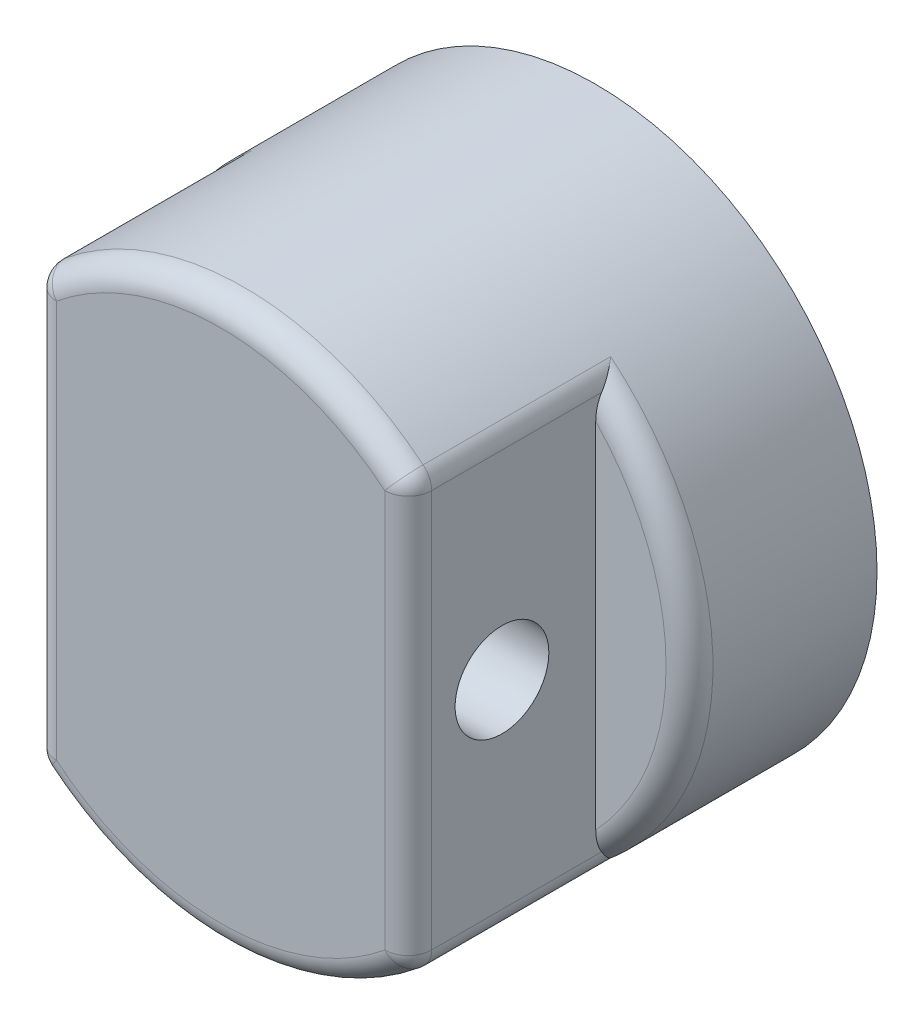
ISO-10303-21;
HEADER;
FILE_DESCRIPTION(('STEP AP214'),'2;1');
FILE_NAME('part.step','',(''),(''),'','','');
FILE_SCHEMA(('AUTOMOTIVE_DESIGN { 1 0 10303 214 1 1 1 1 }'));
ENDSEC;
DATA;
#1=APPLICATION_CONTEXT('core data for automotive mechanical design processes');
#2=APPLICATION_PROTOCOL_DEFINITION('international standard','automotive_design',2000,#1);
#3=PRODUCT_CONTEXT('',#1,'mechanical');
#4=PRODUCT('Part','Part','',(#3));
#5=PRODUCT_RELATED_PRODUCT_CATEGORY('part','',(#4));
#6=PRODUCT_DEFINITION_FORMATION('','',#4);
#7=PRODUCT_DEFINITION_CONTEXT('part definition',#1,'design');
#8=PRODUCT_DEFINITION('design','',#6,#7);
#9=PRODUCT_DEFINITION_SHAPE('','',#8);
#10=(LENGTH_UNIT() NAMED_UNIT(*) SI_UNIT(.MILLI.,.METRE.));
#11=(NAMED_UNIT(*) PLANE_ANGLE_UNIT() SI_UNIT($,.RADIAN.));
#12=(NAMED_UNIT(*) SI_UNIT($,.STERADIAN.) SOLID_ANGLE_UNIT());
#13=UNCERTAINTY_MEASURE_WITH_UNIT(LENGTH_MEASURE(1.E-05),#10,'distance_accuracy_value','');
#14=(GEOMETRIC_REPRESENTATION_CONTEXT(3) GLOBAL_UNCERTAINTY_ASSIGNED_CONTEXT((#13)) GLOBAL_UNIT_ASSIGNED_CONTEXT((#10,
#11,#12)) REPRESENTATION_CONTEXT('',''));
#15=CARTESIAN_POINT('',(0.,0.,0.));
#16=DIRECTION('',(0.,0.,1.));
#17=DIRECTION('',(1.,0.,0.));
#18=AXIS2_PLACEMENT_3D('',#15,#16,#17);
#19=CARTESIAN_POINT('',(0.,0.,40.));
#20=DIRECTION('',(0.,0.,1.));
#21=DIRECTION('',(1.,0.,0.));
#22=AXIS2_PLACEMENT_3D('',#19,#20,#21);
#23=PLANE('',#22);
#24=DIRECTION('',(0.,1.,0.));
#25=VECTOR('',#24,1.);
#26=CARTESIAN_POINT('',(40.,-40.3112887414927,40.));
#27=LINE('',#26,#25);
#28=CARTESIAN_POINT('',(40.,-37.7491721763537,40.));
#29=VERTEX_POINT('',#28);
#30=CARTESIAN_POINT('',(40.,37.7491721763537,40.));
#31=VERTEX_POINT('',#30);
#32=EDGE_CURVE('E140',#29,#31,#27,.T.);
#33=ORIENTED_EDGE('',*,*,#32,.F.);
#34=CARTESIAN_POINT('',(0.,0.,40.));
#35=DIRECTION('',(0.,0.,1.));
#36=DIRECTION('',(1.,0.,0.));
#37=AXIS2_PLACEMENT_3D('',#34,#35,#36);
#38=CIRCLE('',#37,55.);
#39=EDGE_CURVE('E150',#29,#31,#38,.T.);
#40=ORIENTED_EDGE('',*,*,#39,.T.);
#41=EDGE_LOOP('',(#33,#40));
#42=FACE_BOUND('',#41,.T.);
#43=ADVANCED_FACE('F39',(#42),#23,.T.);
#44=CARTESIAN_POINT('',(0.,0.,40.));
#45=DIRECTION('',(0.,0.,-1.));
#46=DIRECTION('',(-1.,0.,0.));
#47=AXIS2_PLACEMENT_3D('',#44,#45,#46);
#48=CYLINDRICAL_SURFACE('',#47,60.);
#49=DIRECTION('',(0.,0.,-1.));
#50=VECTOR('',#49,1.);
#51=CARTESIAN_POINT('',(-38.1818181818182,46.2833529503922,40.));
#52=LINE('',#51,#50);
#53=CARTESIAN_POINT('',(-38.1818181818182,46.2833529503922,35.));
#54=VERTEX_POINT('',#53);
#55=CARTESIAN_POINT('',(-38.1818181818182,46.2833529503922,75.));
#56=VERTEX_POINT('',#55);
#57=EDGE_CURVE('E176',#54,#56,#52,.F.);
#58=ORIENTED_EDGE('',*,*,#57,.T.);
#59=CARTESIAN_POINT('',(0.,0.,75.));
#60=DIRECTION('',(0.,0.,1.));
#61=DIRECTION('',(1.,0.,0.));
#62=AXIS2_PLACEMENT_3D('',#59,#60,#61);
#63=CIRCLE('',#62,60.);
#64=CARTESIAN_POINT('',(38.1818181818182,46.2833529503922,75.));
#65=VERTEX_POINT('',#64);
#66=EDGE_CURVE('E178',#56,#65,#63,.F.);
#67=ORIENTED_EDGE('',*,*,#66,.T.);
#68=DIRECTION('',(0.,0.,-1.));
#69=VECTOR('',#68,1.);
#70=CARTESIAN_POINT('',(38.1818181818182,46.2833529503922,40.));
#71=LINE('',#70,#69);
#72=CARTESIAN_POINT('',(38.1818181818182,46.2833529503922,35.));
#73=VERTEX_POINT('',#72);
#74=EDGE_CURVE('E174',#65,#73,#71,.T.);
#75=ORIENTED_EDGE('',*,*,#74,.T.);
#76=CARTESIAN_POINT('',(0.,0.,35.));
#77=DIRECTION('',(0.,0.,1.));
#78=DIRECTION('',(1.,0.,0.));
#79=AXIS2_PLACEMENT_3D('',#76,#77,#78);
#80=CIRCLE('',#79,60.);
#81=CARTESIAN_POINT('',(38.1818181818182,-46.2833529503922,35.));
#82=VERTEX_POINT('',#81);
#83=EDGE_CURVE('E171',#73,#82,#80,.F.);
#84=ORIENTED_EDGE('',*,*,#83,.T.);
#85=DIRECTION('',(0.,0.,-1.));
#86=VECTOR('',#85,1.);
#87=CARTESIAN_POINT('',(38.1818181818182,-46.2833529503922,40.));
#88=LINE('',#87,#86);
#89=CARTESIAN_POINT('',(38.1818181818182,-46.2833529503922,75.));
#90=VERTEX_POINT('',#89);
#91=EDGE_CURVE('E159',#82,#90,#88,.F.);
#92=ORIENTED_EDGE('',*,*,#91,.T.);
#93=CARTESIAN_POINT('',(0.,0.,75.));
#94=DIRECTION('',(0.,0.,1.));
#95=DIRECTION('',(1.,0.,0.));
#96=AXIS2_PLACEMENT_3D('',#93,#94,#95);
#97=CIRCLE('',#96,60.);
#98=CARTESIAN_POINT('',(-38.1818181818182,-46.2833529503922,75.));
#99=VERTEX_POINT('',#98);
#100=EDGE_CURVE('E156',#90,#99,#97,.F.);
#101=ORIENTED_EDGE('',*,*,#100,.T.);
#102=DIRECTION('',(0.,0.,-1.));
#103=VECTOR('',#102,1.);
#104=CARTESIAN_POINT('',(-38.1818181818182,-46.2833529503922,40.));
#105=LINE('',#104,#103);
#106=CARTESIAN_POINT('',(-38.1818181818182,-46.2833529503922,35.));
#107=VERTEX_POINT('',#106);
#108=EDGE_CURVE('E167',#99,#107,#105,.T.);
#109=ORIENTED_EDGE('',*,*,#108,.T.);
#110=CARTESIAN_POINT('',(0.,0.,35.));
#111=DIRECTION('',(0.,0.,1.));
#112=DIRECTION('',(1.,0.,0.));
#113=AXIS2_PLACEMENT_3D('',#110,#111,#112);
#114=CIRCLE('',#113,60.);
#115=EDGE_CURVE('E169',#107,#54,#114,.F.);
#116=ORIENTED_EDGE('',*,*,#115,.T.);
#117=EDGE_LOOP('',(#58,#67,#75,#84,#92,#101,#109,#116));
#118=FACE_BOUND('',#117,.T.);
#119=CARTESIAN_POINT('',(0.,0.,0.));
#120=DIRECTION('',(0.,0.,1.));
#121=DIRECTION('',(1.,0.,0.));
#122=AXIS2_PLACEMENT_3D('',#119,#120,#121);
#123=CIRCLE('',#122,60.);
#124=CARTESIAN_POINT('',(60.,0.,0.));
#125=VERTEX_POINT('',#124);
#126=EDGE_CURVE('E157',#125,#125,#123,.T.);
#127=ORIENTED_EDGE('',*,*,#126,.T.);
#128=EDGE_LOOP('',(#127));
#129=FACE_BOUND('',#128,.T.);
#130=ADVANCED_FACE('F220',(#118,#129),#48,.T.);
#131=DIRECTION('',(0.,-1.,0.));
#132=VECTOR('',#131,1.);
#133=CARTESIAN_POINT('',(-40.,-40.3112887414927,40.));
#134=LINE('',#133,#132);
#135=CARTESIAN_POINT('',(-40.,37.7491721763537,40.));
#136=VERTEX_POINT('',#135);
#137=CARTESIAN_POINT('',(-40.,-37.7491721763537,40.));
#138=VERTEX_POINT('',#137);
#139=EDGE_CURVE('E152',#136,#138,#134,.T.);
#140=ORIENTED_EDGE('',*,*,#139,.F.);
#141=CARTESIAN_POINT('',(0.,0.,40.));
#142=DIRECTION('',(0.,0.,1.));
#143=DIRECTION('',(1.,0.,0.));
#144=AXIS2_PLACEMENT_3D('',#141,#142,#143);
#145=CIRCLE('',#144,55.);
#146=EDGE_CURVE('E180',#136,#138,#145,.T.);
#147=ORIENTED_EDGE('',*,*,#146,.T.);
#148=EDGE_LOOP('',(#140,#147));
#149=FACE_BOUND('',#148,.T.);
#150=ADVANCED_FACE('F358',(#149),#23,.T.);
#151=CARTESIAN_POINT('',(0.,0.,0.));
#152=DIRECTION('',(0.,0.,1.));
#153=DIRECTION('',(1.,0.,0.));
#154=AXIS2_PLACEMENT_3D('',#151,#152,#153);
#155=PLANE('',#154);
#156=CARTESIAN_POINT('',(0.,0.,0.));
#157=DIRECTION('',(0.,0.,-1.));
#158=DIRECTION('',(-1.,0.,0.));
#159=AXIS2_PLACEMENT_3D('',#156,#157,#158);
#160=CIRCLE('',#159,40.15);
#161=CARTESIAN_POINT('',(-40.15,0.,0.));
#162=VERTEX_POINT('',#161);
#163=EDGE_CURVE('E151',#162,#162,#160,.T.);
#164=ORIENTED_EDGE('',*,*,#163,.F.);
#165=EDGE_LOOP('',(#164));
#166=FACE_BOUND('',#165,.T.);
#167=ORIENTED_EDGE('',*,*,#126,.F.);
#168=EDGE_LOOP('',(#167));
#169=FACE_BOUND('',#168,.T.);
#170=ADVANCED_FACE('F372',(#166,#169),#155,.F.);
#171=CARTESIAN_POINT('',(0.,0.,30.));
#172=DIRECTION('',(0.,0.,-1.));
#173=DIRECTION('',(-1.,0.,0.));
#174=AXIS2_PLACEMENT_3D('',#171,#172,#173);
#175=CYLINDRICAL_SURFACE('',#174,40.15);
#176=CARTESIAN_POINT('',(0.,0.,30.));
#177=DIRECTION('',(0.,0.,-1.));
#178=DIRECTION('',(-1.,0.,0.));
#179=AXIS2_PLACEMENT_3D('',#176,#177,#178);
#180=CIRCLE('',#179,40.15);
#181=CARTESIAN_POINT('',(-40.15,0.,30.));
#182=VERTEX_POINT('',#181);
#183=EDGE_CURVE('E162',#182,#182,#180,.T.);
#184=ORIENTED_EDGE('',*,*,#183,.F.);
#185=EDGE_LOOP('',(#184));
#186=FACE_BOUND('',#185,.T.);
#187=ORIENTED_EDGE('',*,*,#163,.T.);
#188=EDGE_LOOP('',(#187));
#189=FACE_BOUND('',#188,.T.);
#190=ADVANCED_FACE('F370',(#186,#189),#175,.F.);
#191=CARTESIAN_POINT('',(0.,0.,30.));
#192=DIRECTION('',(0.,0.,-1.));
#193=DIRECTION('',(-1.,0.,0.));
#194=AXIS2_PLACEMENT_3D('',#191,#192,#193);
#195=PLANE('',#194);
#196=ORIENTED_EDGE('',*,*,#183,.T.);
#197=EDGE_LOOP('',(#196));
#198=FACE_BOUND('',#197,.T.);
#199=ADVANCED_FACE('F387',(#198),#195,.T.);
#200=CARTESIAN_POINT('',(-40.,-40.3112887414927,80.));
#201=DIRECTION('',(1.,0.,0.));
#202=DIRECTION('',(0.,0.,-1.));
#203=AXIS2_PLACEMENT_3D('',#200,#201,#202);
#204=PLANE('',#203);
#205=CARTESIAN_POINT('',(-40.,0.,60.));
#206=DIRECTION('',(1.,0.,0.));
#207=DIRECTION('',(0.,0.,-1.));
#208=AXIS2_PLACEMENT_3D('',#205,#206,#207);
#209=CIRCLE('',#208,10.);
#210=CARTESIAN_POINT('',(-40.,0.,50.));
#211=VERTEX_POINT('',#210);
#212=EDGE_CURVE('E359',#211,#211,#209,.T.);
#213=ORIENTED_EDGE('',*,*,#212,.T.);
#214=EDGE_LOOP('',(#213));
#215=FACE_BOUND('',#214,.T.);
#216=DIRECTION('',(0.,-1.,0.));
#217=VECTOR('',#216,1.);
#218=CARTESIAN_POINT('',(-40.,44.7213595499958,75.));
#219=LINE('',#218,#217);
#220=CARTESIAN_POINT('',(-40.,-42.4264068711928,75.));
#221=VERTEX_POINT('',#220);
#222=CARTESIAN_POINT('',(-40.,42.4264068711928,75.));
#223=VERTEX_POINT('',#222);
#224=EDGE_CURVE('E193',#221,#223,#219,.F.);
#225=ORIENTED_EDGE('',*,*,#224,.T.);
#226=DIRECTION('',(0.,0.,-1.));
#227=VECTOR('',#226,1.);
#228=CARTESIAN_POINT('',(-40.,42.4264068711929,80.));
#229=LINE('',#228,#227);
#230=CARTESIAN_POINT('',(-40.,42.4264068711928,38.7479440137001));
#231=VERTEX_POINT('',#230);
#232=EDGE_CURVE('E61',#223,#231,#229,.T.);
#233=ORIENTED_EDGE('',*,*,#232,.T.);
#234=CARTESIAN_POINT('',(-40.,42.4264068711928,38.7479440137001));
#235=CARTESIAN_POINT('',(-40.,42.245528548577,38.8641168378473));
#236=CARTESIAN_POINT('',(-40.,42.0590680282157,38.9712786839745));
#237=CARTESIAN_POINT('',(-40.,41.6774854411232,39.168205924506));
#238=CARTESIAN_POINT('',(-40.,41.4823761190042,39.257995934521));
#239=CARTESIAN_POINT('',(-40.,41.089391400108,39.4195203535233));
#240=CARTESIAN_POINT('',(-40.,40.891646861117,39.4915765072415));
#241=CARTESIAN_POINT('',(-40.,40.4912580462267,39.6206525430564));
#242=CARTESIAN_POINT('',(-40.,40.2886121928788,39.6776675120357));
#243=CARTESIAN_POINT('',(-40.,39.8952010391163,39.7735738566736));
#244=CARTESIAN_POINT('',(-40.,39.7046866785815,39.8135048752635));
#245=CARTESIAN_POINT('',(-40.,39.3215864407999,39.8815580828408));
#246=CARTESIAN_POINT('',(-40.,39.1290007473495,39.9096813108504));
#247=CARTESIAN_POINT('',(-40.,38.7388629725387,39.9549860214966));
#248=CARTESIAN_POINT('',(-40.,38.5412858899752,39.9719502969141));
#249=CARTESIAN_POINT('',(-40.,38.1455213414486,39.9944494245809));
#250=CARTESIAN_POINT('',(-40.,37.9473340181729,39.9999867714793));
#251=CARTESIAN_POINT('',(-40.,37.7491721763538,40.));
#252=B_SPLINE_CURVE_WITH_KNOTS('',3,(#234,#235,#236,#237,#238,#239,#240,#241,#242,#243,#244,
#245,#246,#247,#248,#249,#250,#251),.UNSPECIFIED.,.F.,.F.,(4,2,2,2,2,2,2,2,4),(0.,
0.644407323161822,1.28789473429558,1.91866571432605,2.54964247771465,3.13322456476076,
3.71675528894623,4.31133235490235,4.90577960310671),.UNSPECIFIED.);
#253=EDGE_CURVE('E11',#231,#136,#252,.T.);
#254=ORIENTED_EDGE('',*,*,#253,.T.);
#255=ORIENTED_EDGE('',*,*,#139,.T.);
#256=CARTESIAN_POINT('',(-40.,-37.7491721763537,40.));
#257=CARTESIAN_POINT('',(-40.,-37.8885158574648,39.9999961776683));
#258=CARTESIAN_POINT('',(-40.,-38.0278463970264,39.9972559944835));
#259=CARTESIAN_POINT('',(-40.,-38.3063028714344,39.9861803853392));
#260=CARTESIAN_POINT('',(-40.,-38.4454287761386,39.9778442045049));
#261=CARTESIAN_POINT('',(-40.,-38.8627104733616,39.9442158091399));
#262=CARTESIAN_POINT('',(-40.,-39.1402320723079,39.9103027730007));
#263=CARTESIAN_POINT('',(-40.,-39.6836049127385,39.8195943297758));
#264=CARTESIAN_POINT('',(-40.,-39.9495662694991,39.7634602104427));
#265=CARTESIAN_POINT('',(-40.,-40.4749848374606,39.6270840011207));
#266=CARTESIAN_POINT('',(-40.,-40.7344488648532,39.5468684300561));
#267=CARTESIAN_POINT('',(-40.,-41.2387508325053,39.3627182756754));
#268=CARTESIAN_POINT('',(-40.,-41.4837821446549,39.2593219329418));
#269=CARTESIAN_POINT('',(-40.,-41.8433850553355,39.0839293374875));
#270=CARTESIAN_POINT('',(-40.,-41.96271501647,39.0215855418078));
#271=CARTESIAN_POINT('',(-40.,-42.1975714543223,38.889991422618));
#272=CARTESIAN_POINT('',(-40.,-42.3130961453193,38.8207379162775));
#273=CARTESIAN_POINT('',(-40.,-42.4264068711928,38.7479440137001));
#274=B_SPLINE_CURVE_WITH_KNOTS('',3,(#256,#257,#258,#259,#260,#261,#262,#263,#264,#265,#266,
#267,#268,#269,#270,#271,#272,#273),.UNSPECIFIED.,.F.,.F.,(4,2,2,2,2,2,2,2,4),(0.,
0.417975115044326,0.836006624371732,1.67367939237587,2.48810042248645,3.30162786708419,
4.09792816629862,4.50162619096183,4.90551103777),.UNSPECIFIED.);
#275=CARTESIAN_POINT('',(-40.,-42.4264068711928,38.7479440137001));
#276=VERTEX_POINT('',#275);
#277=EDGE_CURVE('E54',#138,#276,#274,.T.);
#278=ORIENTED_EDGE('',*,*,#277,.T.);
#279=DIRECTION('',(0.,0.,-1.));
#280=VECTOR('',#279,1.);
#281=CARTESIAN_POINT('',(-40.,-42.4264068711928,80.));
#282=LINE('',#281,#280);
#283=EDGE_CURVE('E69',#276,#221,#282,.F.);
#284=ORIENTED_EDGE('',*,*,#283,.T.);
#285=EDGE_LOOP('',(#225,#233,#254,#255,#278,#284));
#286=FACE_BOUND('',#285,.T.);
#287=ADVANCED_FACE('F356',(#215,#286),#204,.F.);
#288=CARTESIAN_POINT('',(40.,-40.3112887414927,80.));
#289=DIRECTION('',(-1.,0.,0.));
#290=DIRECTION('',(0.,0.,1.));
#291=AXIS2_PLACEMENT_3D('',#288,#289,#290);
#292=PLANE('',#291);
#293=CARTESIAN_POINT('',(40.,0.,60.));
#294=DIRECTION('',(1.,0.,0.));
#295=DIRECTION('',(0.,0.,-1.));
#296=AXIS2_PLACEMENT_3D('',#293,#294,#295);
#297=CIRCLE('',#296,10.);
#298=CARTESIAN_POINT('',(40.,0.,50.));
#299=VERTEX_POINT('',#298);
#300=EDGE_CURVE('E362',#299,#299,#297,.T.);
#301=ORIENTED_EDGE('',*,*,#300,.F.);
#302=EDGE_LOOP('',(#301));
#303=FACE_BOUND('',#302,.T.);
#304=DIRECTION('',(0.,1.,0.));
#305=VECTOR('',#304,1.);
#306=CARTESIAN_POINT('',(40.,-44.7213595499958,75.));
#307=LINE('',#306,#305);
#308=CARTESIAN_POINT('',(40.,42.4264068711928,75.));
#309=VERTEX_POINT('',#308);
#310=CARTESIAN_POINT('',(40.,-42.4264068711928,75.));
#311=VERTEX_POINT('',#310);
#312=EDGE_CURVE('E198',#309,#311,#307,.F.);
#313=ORIENTED_EDGE('',*,*,#312,.T.);
#314=DIRECTION('',(0.,0.,-1.));
#315=VECTOR('',#314,1.);
#316=CARTESIAN_POINT('',(40.,-42.4264068711928,80.));
#317=LINE('',#316,#315);
#318=CARTESIAN_POINT('',(40.,-42.4264068711928,38.7479440137001));
#319=VERTEX_POINT('',#318);
#320=EDGE_CURVE('E142',#311,#319,#317,.T.);
#321=ORIENTED_EDGE('',*,*,#320,.T.);
#322=CARTESIAN_POINT('',(40.,-42.4264068711928,38.7479440137001));
#323=CARTESIAN_POINT('',(40.,-42.245528548577,38.8641168378473));
#324=CARTESIAN_POINT('',(40.,-42.0590680282157,38.9712786839745));
#325=CARTESIAN_POINT('',(40.,-41.6774854411232,39.168205924506));
#326=CARTESIAN_POINT('',(40.,-41.4823761190042,39.257995934521));
#327=CARTESIAN_POINT('',(40.,-41.089391400108,39.4195203535233));
#328=CARTESIAN_POINT('',(40.,-40.891646861117,39.4915765072415));
#329=CARTESIAN_POINT('',(40.,-40.4912580462267,39.6206525430564));
#330=CARTESIAN_POINT('',(40.,-40.2886121928788,39.6776675120357));
#331=CARTESIAN_POINT('',(40.,-39.8952010391163,39.7735738566736));
#332=CARTESIAN_POINT('',(40.,-39.7046866785815,39.8135048752635));
#333=CARTESIAN_POINT('',(40.,-39.3215864407999,39.8815580828408));
#334=CARTESIAN_POINT('',(40.,-39.1290007473495,39.9096813108504));
#335=CARTESIAN_POINT('',(40.,-38.7388629725387,39.9549860214966));
#336=CARTESIAN_POINT('',(40.,-38.5412858899752,39.9719502969141));
#337=CARTESIAN_POINT('',(40.,-38.1455213414486,39.9944494245809));
#338=CARTESIAN_POINT('',(40.,-37.9473340181729,39.9999867714793));
#339=CARTESIAN_POINT('',(40.,-37.7491721763537,40.));
#340=B_SPLINE_CURVE_WITH_KNOTS('',3,(#322,#323,#324,#325,#326,#327,#328,#329,#330,#331,#332,
#333,#334,#335,#336,#337,#338,#339),.UNSPECIFIED.,.F.,.F.,(4,2,2,2,2,2,2,2,4),(0.,
0.644407323161822,1.28789473429558,1.91866571432605,2.54964247771465,3.13322456476076,
3.71675528894623,4.31133235490236,4.90577960310672),.UNSPECIFIED.);
#341=EDGE_CURVE('E136',#319,#29,#340,.T.);
#342=ORIENTED_EDGE('',*,*,#341,.T.);
#343=ORIENTED_EDGE('',*,*,#32,.T.);
#344=CARTESIAN_POINT('',(40.,37.7491721763537,40.));
#345=CARTESIAN_POINT('',(40.,37.8885158574648,39.9999961776683));
#346=CARTESIAN_POINT('',(40.,38.0278463970264,39.9972559944835));
#347=CARTESIAN_POINT('',(40.,38.3063028714344,39.9861803853392));
#348=CARTESIAN_POINT('',(40.,38.4454287761386,39.9778442045049));
#349=CARTESIAN_POINT('',(40.,38.8627104733616,39.9442158091399));
#350=CARTESIAN_POINT('',(40.,39.1402320723079,39.9103027730007));
#351=CARTESIAN_POINT('',(40.,39.6836049127385,39.8195943297758));
#352=CARTESIAN_POINT('',(40.,39.9495662694991,39.7634602104427));
#353=CARTESIAN_POINT('',(40.,40.4749848374606,39.6270840011207));
#354=CARTESIAN_POINT('',(40.,40.7344488648532,39.5468684300561));
#355=CARTESIAN_POINT('',(40.,41.2387508325053,39.3627182756754));
#356=CARTESIAN_POINT('',(40.,41.4837821446549,39.2593219329419));
#357=CARTESIAN_POINT('',(40.,41.8433850553355,39.0839293374875));
#358=CARTESIAN_POINT('',(40.,41.96271501647,39.0215855418078));
#359=CARTESIAN_POINT('',(40.,42.1975714543223,38.889991422618));
#360=CARTESIAN_POINT('',(40.,42.3130961453193,38.8207379162775));
#361=CARTESIAN_POINT('',(40.,42.4264068711928,38.7479440137001));
#362=B_SPLINE_CURVE_WITH_KNOTS('',3,(#344,#345,#346,#347,#348,#349,#350,#351,#352,#353,#354,
#355,#356,#357,#358,#359,#360,#361),.UNSPECIFIED.,.F.,.F.,(4,2,2,2,2,2,2,2,4),(0.,
0.417975115044326,0.836006624371732,1.67367939237589,2.48810042248647,3.30162786708419,
4.09792816629861,4.50162619096183,4.90551103777001),.UNSPECIFIED.);
#363=CARTESIAN_POINT('',(40.,42.4264068711928,38.7479440137001));
#364=VERTEX_POINT('',#363);
#365=EDGE_CURVE('E146',#31,#364,#362,.T.);
#366=ORIENTED_EDGE('',*,*,#365,.T.);
#367=DIRECTION('',(0.,0.,-1.));
#368=VECTOR('',#367,1.);
#369=CARTESIAN_POINT('',(40.,42.4264068711929,80.));
#370=LINE('',#369,#368);
#371=EDGE_CURVE('E196',#364,#309,#370,.F.);
#372=ORIENTED_EDGE('',*,*,#371,.T.);
#373=EDGE_LOOP('',(#313,#321,#342,#343,#366,#372));
#374=FACE_BOUND('',#373,.T.);
#375=ADVANCED_FACE('F138',(#303,#374),#292,.F.);
#376=CARTESIAN_POINT('',(0.,0.,80.));
#377=DIRECTION('',(0.,0.,1.));
#378=DIRECTION('',(1.,0.,0.));
#379=AXIS2_PLACEMENT_3D('',#376,#377,#378);
#380=PLANE('',#379);
#381=DIRECTION('',(0.,1.,0.));
#382=VECTOR('',#381,1.);
#383=CARTESIAN_POINT('',(35.,44.7213595499958,80.));
#384=LINE('',#383,#382);
#385=CARTESIAN_POINT('',(35.,-42.4264068711929,80.));
#386=VERTEX_POINT('',#385);
#387=CARTESIAN_POINT('',(35.,42.4264068711929,80.));
#388=VERTEX_POINT('',#387);
#389=EDGE_CURVE('E185',#386,#388,#384,.T.);
#390=ORIENTED_EDGE('',*,*,#389,.T.);
#391=CARTESIAN_POINT('',(0.,0.,80.));
#392=DIRECTION('',(0.,0.,1.));
#393=DIRECTION('',(1.,0.,0.));
#394=AXIS2_PLACEMENT_3D('',#391,#392,#393);
#395=CIRCLE('',#394,55.);
#396=CARTESIAN_POINT('',(-35.,42.4264068711929,80.));
#397=VERTEX_POINT('',#396);
#398=EDGE_CURVE('E190',#388,#397,#395,.T.);
#399=ORIENTED_EDGE('',*,*,#398,.T.);
#400=DIRECTION('',(0.,-1.,0.));
#401=VECTOR('',#400,1.);
#402=CARTESIAN_POINT('',(-35.,-44.7213595499958,80.));
#403=LINE('',#402,#401);
#404=CARTESIAN_POINT('',(-35.,-42.4264068711929,80.));
#405=VERTEX_POINT('',#404);
#406=EDGE_CURVE('E187',#397,#405,#403,.T.);
#407=ORIENTED_EDGE('',*,*,#406,.T.);
#408=CARTESIAN_POINT('',(0.,0.,80.));
#409=DIRECTION('',(0.,0.,1.));
#410=DIRECTION('',(1.,0.,0.));
#411=AXIS2_PLACEMENT_3D('',#408,#409,#410);
#412=CIRCLE('',#411,55.);
#413=EDGE_CURVE('E183',#405,#386,#412,.T.);
#414=ORIENTED_EDGE('',*,*,#413,.T.);
#415=EDGE_LOOP('',(#390,#399,#407,#414));
#416=FACE_BOUND('',#415,.T.);
#417=ADVANCED_FACE('F344',(#416),#380,.T.);
#418=CARTESIAN_POINT('',(-46.,0.,60.));
#419=DIRECTION('',(1.,0.,0.));
#420=DIRECTION('',(0.,0.,-1.));
#421=AXIS2_PLACEMENT_3D('',#418,#419,#420);
#422=CYLINDRICAL_SURFACE('',#421,10.);
#423=ORIENTED_EDGE('',*,*,#300,.T.);
#424=EDGE_LOOP('',(#423));
#425=FACE_BOUND('',#424,.T.);
#426=ORIENTED_EDGE('',*,*,#212,.F.);
#427=EDGE_LOOP('',(#426));
#428=FACE_BOUND('',#427,.T.);
#429=ADVANCED_FACE('F407',(#425,#428),#422,.F.);
#430=CARTESIAN_POINT('',(0.,0.,35.));
#431=DIRECTION('',(0.,0.,1.));
#432=DIRECTION('',(1.,0.,0.));
#433=AXIS2_PLACEMENT_3D('',#430,#431,#432);
#434=TOROIDAL_SURFACE('',#433,55.,5.);
#435=CARTESIAN_POINT('',(-40.,42.4264068711928,38.7479440137001));
#436=CARTESIAN_POINT('',(-39.9999606062777,42.6061664269778,38.6324157418636));
#437=CARTESIAN_POINT('',(-39.990309779232,42.782764479842,38.5123311395046));
#438=CARTESIAN_POINT('',(-39.9535156213565,43.1285086189864,38.2649226677309));
#439=CARTESIAN_POINT('',(-39.9264018302016,43.2976667750631,38.1376113537441));
#440=CARTESIAN_POINT('',(-39.8564779111534,43.6276488853861,37.8775098498907));
#441=CARTESIAN_POINT('',(-39.8137026447009,43.7884904512715,37.7447324054633));
#442=CARTESIAN_POINT('',(-39.7138305401617,44.1017747612408,37.4746086796682));
#443=CARTESIAN_POINT('',(-39.6567256861655,44.2542127459888,37.3372598785284));
#444=CARTESIAN_POINT('',(-39.5127341881253,44.5889364308508,37.0226328439824));
#445=CARTESIAN_POINT('',(-39.4219645899471,44.7685903444406,36.8443135457216));
#446=CARTESIAN_POINT('',(-39.2216877478719,45.1128687719239,36.4839002683093));
#447=CARTESIAN_POINT('',(-39.1121751439068,45.2774889658094,36.301805222509));
#448=CARTESIAN_POINT('',(-38.7582550689598,45.7473890797778,35.7522870019368));
#449=CARTESIAN_POINT('',(-38.4880517021139,46.0296376823441,35.3807501141886));
#450=CARTESIAN_POINT('',(-38.1873024882329,46.2788237112519,35.0068099662821));
#451=CARTESIAN_POINT('',(-38.1845615066197,46.2810898244923,35.0034049383167));
#452=CARTESIAN_POINT('',(-38.1818181818182,46.2833529503922,35.));
#453=B_SPLINE_CURVE_WITH_KNOTS('',3,(#435,#436,#437,#438,#439,#440,#441,#442,#443,#444,#445,
#446,#447,#448,#449,#450,#451,#452),.UNSPECIFIED.,.F.,.F.,(4,2,2,2,2,2,2,2,4),(0.,
0.640478086058564,1.27987559951696,1.91785842295815,2.55619892994397,3.36163059567363,
4.16729298236213,5.77463097881393,5.78940196211781),.UNSPECIFIED.);
#454=EDGE_CURVE('E282',#54,#231,#453,.F.);
#455=ORIENTED_EDGE('',*,*,#454,.F.);
#456=ORIENTED_EDGE('',*,*,#115,.F.);
#457=CARTESIAN_POINT('',(-40.,-42.4264068711928,38.7479440137001));
#458=CARTESIAN_POINT('',(-39.9999606062777,-42.6061664269778,38.6324157418636));
#459=CARTESIAN_POINT('',(-39.990309779232,-42.782764479842,38.5123311395046));
#460=CARTESIAN_POINT('',(-39.9535156213565,-43.1285086189864,38.2649226677309));
#461=CARTESIAN_POINT('',(-39.9264018302016,-43.2976667750631,38.1376113537441));
#462=CARTESIAN_POINT('',(-39.8564779111534,-43.6276488853861,37.8775098498907));
#463=CARTESIAN_POINT('',(-39.8137026447009,-43.7884904512715,37.7447324054633));
#464=CARTESIAN_POINT('',(-39.7138305401617,-44.1017747612408,37.4746086796682));
#465=CARTESIAN_POINT('',(-39.6567256861655,-44.2542127459888,37.3372598785284));
#466=CARTESIAN_POINT('',(-39.5127341881253,-44.5889364308508,37.0226328439824));
#467=CARTESIAN_POINT('',(-39.4219645899471,-44.7685903444406,36.8443135457216));
#468=CARTESIAN_POINT('',(-39.2216877478719,-45.1128687719239,36.4839002683093));
#469=CARTESIAN_POINT('',(-39.1121751439068,-45.2774889658094,36.301805222509));
#470=CARTESIAN_POINT('',(-38.7582550689598,-45.7473890797778,35.7522870019368));
#471=CARTESIAN_POINT('',(-38.4880517021139,-46.0296376823441,35.3807501141886));
#472=CARTESIAN_POINT('',(-38.1873024882329,-46.2788237112519,35.0068099662821));
#473=CARTESIAN_POINT('',(-38.1845615066197,-46.2810898244923,35.0034049383167));
#474=CARTESIAN_POINT('',(-38.1818181818182,-46.2833529503922,35.));
#475=B_SPLINE_CURVE_WITH_KNOTS('',3,(#457,#458,#459,#460,#461,#462,#463,#464,#465,#466,#467,
#468,#469,#470,#471,#472,#473,#474),.UNSPECIFIED.,.F.,.F.,(4,2,2,2,2,2,2,2,4),(0.,
0.640478086058564,1.27987559951696,1.91785842295815,2.55619892994397,3.36163059567363,
4.16729298236213,5.77463097881393,5.78940196211781),.UNSPECIFIED.);
#476=EDGE_CURVE('E44',#276,#107,#475,.T.);
#477=ORIENTED_EDGE('',*,*,#476,.F.);
#478=ORIENTED_EDGE('',*,*,#277,.F.);
#479=ORIENTED_EDGE('',*,*,#146,.F.);
#480=ORIENTED_EDGE('',*,*,#253,.F.);
#481=EDGE_LOOP('',(#455,#456,#477,#478,#479,#480));
#482=FACE_BOUND('',#481,.T.);
#483=ADVANCED_FACE('F280',(#482),#434,.T.);
#484=CARTESIAN_POINT('',(-35.,-42.4264068711928,40.));
#485=DIRECTION('',(0.,0.,-1.));
#486=DIRECTION('',(-1.,0.,0.));
#487=AXIS2_PLACEMENT_3D('',#484,#485,#486);
#488=CYLINDRICAL_SURFACE('',#487,5.);
#489=ORIENTED_EDGE('',*,*,#476,.T.);
#490=ORIENTED_EDGE('',*,*,#108,.F.);
#491=CARTESIAN_POINT('',(-35.,-42.4264068711928,75.));
#492=DIRECTION('',(0.,0.,1.));
#493=DIRECTION('',(1.,0.,0.));
#494=AXIS2_PLACEMENT_3D('',#491,#492,#493);
#495=CIRCLE('',#494,5.);
#496=EDGE_CURVE('E289',#221,#99,#495,.T.);
#497=ORIENTED_EDGE('',*,*,#496,.F.);
#498=ORIENTED_EDGE('',*,*,#283,.F.);
#499=EDGE_LOOP('',(#489,#490,#497,#498));
#500=FACE_BOUND('',#499,.T.);
#501=ADVANCED_FACE('F41',(#500),#488,.T.);
#502=CARTESIAN_POINT('',(-35.,0.,75.));
#503=DIRECTION('',(0.,1.,0.));
#504=DIRECTION('',(0.,0.,1.));
#505=AXIS2_PLACEMENT_3D('',#502,#503,#504);
#506=CYLINDRICAL_SURFACE('',#505,5.);
#507=CARTESIAN_POINT('',(-35.,42.4264068711928,75.));
#508=DIRECTION('',(0.,1.,0.));
#509=DIRECTION('',(0.,0.,1.));
#510=AXIS2_PLACEMENT_3D('',#507,#508,#509);
#511=CIRCLE('',#510,5.);
#512=EDGE_CURVE('E295',#223,#397,#511,.T.);
#513=ORIENTED_EDGE('',*,*,#512,.F.);
#514=ORIENTED_EDGE('',*,*,#224,.F.);
#515=CARTESIAN_POINT('',(-35.,-42.4264068711929,75.));
#516=DIRECTION('',(0.,-1.,0.));
#517=DIRECTION('',(1.,0.,0.));
#518=AXIS2_PLACEMENT_3D('',#515,#516,#517);
#519=CIRCLE('',#518,5.);
#520=EDGE_CURVE('E292',#405,#221,#519,.T.);
#521=ORIENTED_EDGE('',*,*,#520,.F.);
#522=ORIENTED_EDGE('',*,*,#406,.F.);
#523=EDGE_LOOP('',(#513,#514,#521,#522));
#524=FACE_BOUND('',#523,.T.);
#525=ADVANCED_FACE('F278',(#524),#506,.T.);
#526=CARTESIAN_POINT('',(-35.,42.4264068711928,40.));
#527=DIRECTION('',(0.,0.,-1.));
#528=DIRECTION('',(-1.,0.,0.));
#529=AXIS2_PLACEMENT_3D('',#526,#527,#528);
#530=CYLINDRICAL_SURFACE('',#529,5.);
#531=ORIENTED_EDGE('',*,*,#454,.T.);
#532=ORIENTED_EDGE('',*,*,#232,.F.);
#533=CARTESIAN_POINT('',(-35.,42.4264068711928,75.));
#534=DIRECTION('',(0.,0.,1.));
#535=DIRECTION('',(1.,0.,0.));
#536=AXIS2_PLACEMENT_3D('',#533,#534,#535);
#537=CIRCLE('',#536,5.);
#538=EDGE_CURVE('E298',#56,#223,#537,.T.);
#539=ORIENTED_EDGE('',*,*,#538,.F.);
#540=ORIENTED_EDGE('',*,*,#57,.F.);
#541=EDGE_LOOP('',(#531,#532,#539,#540));
#542=FACE_BOUND('',#541,.T.);
#543=ADVANCED_FACE('F274',(#542),#530,.T.);
#544=CARTESIAN_POINT('',(-35.,-42.4264068711928,75.));
#545=DIRECTION('',(0.,0.,1.));
#546=DIRECTION('',(1.,0.,0.));
#547=AXIS2_PLACEMENT_3D('',#544,#545,#546);
#548=SPHERICAL_SURFACE('',#547,5.);
#549=ORIENTED_EDGE('',*,*,#520,.T.);
#550=ORIENTED_EDGE('',*,*,#496,.T.);
#551=CARTESIAN_POINT('',(-35.,-42.4264068711928,75.));
#552=DIRECTION('',(-0.77138921583987,0.636363636363637,0.));
#553=DIRECTION('',(-0.636363636363636,-0.77138921583987,0.));
#554=AXIS2_PLACEMENT_3D('',#551,#552,#553);
#555=CIRCLE('',#554,5.);
#556=EDGE_CURVE('E301',#405,#99,#555,.F.);
#557=ORIENTED_EDGE('',*,*,#556,.F.);
#558=EDGE_LOOP('',(#549,#550,#557));
#559=FACE_BOUND('',#558,.T.);
#560=ADVANCED_FACE('F270',(#559),#548,.T.);
#561=CARTESIAN_POINT('',(-35.,42.4264068711928,75.));
#562=DIRECTION('',(0.,0.,1.));
#563=DIRECTION('',(1.,0.,0.));
#564=AXIS2_PLACEMENT_3D('',#561,#562,#563);
#565=SPHERICAL_SURFACE('',#564,5.);
#566=ORIENTED_EDGE('',*,*,#538,.T.);
#567=ORIENTED_EDGE('',*,*,#512,.T.);
#568=CARTESIAN_POINT('',(-35.,42.4264068711929,75.));
#569=DIRECTION('',(-0.771389215839869,-0.636363636363637,0.));
#570=DIRECTION('',(0.636363636363637,-0.771389215839869,0.));
#571=AXIS2_PLACEMENT_3D('',#568,#569,#570);
#572=CIRCLE('',#571,5.);
#573=EDGE_CURVE('E304',#56,#397,#572,.F.);
#574=ORIENTED_EDGE('',*,*,#573,.F.);
#575=EDGE_LOOP('',(#566,#567,#574));
#576=FACE_BOUND('',#575,.T.);
#577=ADVANCED_FACE('F266',(#576),#565,.T.);
#578=CARTESIAN_POINT('',(0.,0.,75.));
#579=DIRECTION('',(0.,0.,1.));
#580=DIRECTION('',(1.,0.,0.));
#581=AXIS2_PLACEMENT_3D('',#578,#579,#580);
#582=TOROIDAL_SURFACE('',#581,55.,5.);
#583=ORIENTED_EDGE('',*,*,#556,.T.);
#584=ORIENTED_EDGE('',*,*,#100,.F.);
#585=CARTESIAN_POINT('',(35.,-42.4264068711929,75.));
#586=DIRECTION('',(0.771389215839869,0.636363636363637,0.));
#587=DIRECTION('',(-0.636363636363637,0.771389215839869,0.));
#588=AXIS2_PLACEMENT_3D('',#585,#586,#587);
#589=CIRCLE('',#588,5.);
#590=EDGE_CURVE('E307',#386,#90,#589,.T.);
#591=ORIENTED_EDGE('',*,*,#590,.F.);
#592=ORIENTED_EDGE('',*,*,#413,.F.);
#593=EDGE_LOOP('',(#583,#584,#591,#592));
#594=FACE_BOUND('',#593,.T.);
#595=ADVANCED_FACE('F262',(#594),#582,.T.);
#596=CARTESIAN_POINT('',(35.,0.,75.));
#597=DIRECTION('',(0.,-1.,0.));
#598=DIRECTION('',(0.,0.,-1.));
#599=AXIS2_PLACEMENT_3D('',#596,#597,#598);
#600=CYLINDRICAL_SURFACE('',#599,5.);
#601=CARTESIAN_POINT('',(35.,42.4264068711929,75.));
#602=DIRECTION('',(0.,1.,0.));
#603=DIRECTION('',(-1.,0.,0.));
#604=AXIS2_PLACEMENT_3D('',#601,#602,#603);
#605=CIRCLE('',#604,5.);
#606=EDGE_CURVE('E313',#388,#309,#605,.T.);
#607=ORIENTED_EDGE('',*,*,#606,.F.);
#608=ORIENTED_EDGE('',*,*,#389,.F.);
#609=CARTESIAN_POINT('',(35.,-42.4264068711928,75.));
#610=DIRECTION('',(0.,-1.,0.));
#611=DIRECTION('',(0.,0.,-1.));
#612=AXIS2_PLACEMENT_3D('',#609,#610,#611);
#613=CIRCLE('',#612,5.);
#614=EDGE_CURVE('E310',#311,#386,#613,.T.);
#615=ORIENTED_EDGE('',*,*,#614,.F.);
#616=ORIENTED_EDGE('',*,*,#312,.F.);
#617=EDGE_LOOP('',(#607,#608,#615,#616));
#618=FACE_BOUND('',#617,.T.);
#619=ADVANCED_FACE('F258',(#618),#600,.T.);
#620=CARTESIAN_POINT('',(0.,0.,75.));
#621=DIRECTION('',(0.,0.,1.));
#622=DIRECTION('',(1.,0.,0.));
#623=AXIS2_PLACEMENT_3D('',#620,#621,#622);
#624=TOROIDAL_SURFACE('',#623,55.,5.);
#625=ORIENTED_EDGE('',*,*,#573,.T.);
#626=ORIENTED_EDGE('',*,*,#398,.F.);
#627=CARTESIAN_POINT('',(35.,42.4264068711928,75.));
#628=DIRECTION('',(0.77138921583987,-0.636363636363637,0.));
#629=DIRECTION('',(0.636363636363636,0.77138921583987,0.));
#630=AXIS2_PLACEMENT_3D('',#627,#628,#629);
#631=CIRCLE('',#630,5.);
#632=EDGE_CURVE('E316',#65,#388,#631,.T.);
#633=ORIENTED_EDGE('',*,*,#632,.F.);
#634=ORIENTED_EDGE('',*,*,#66,.F.);
#635=EDGE_LOOP('',(#625,#626,#633,#634));
#636=FACE_BOUND('',#635,.T.);
#637=ADVANCED_FACE('F254',(#636),#624,.T.);
#638=CARTESIAN_POINT('',(35.,-42.4264068711928,75.));
#639=DIRECTION('',(0.,0.,1.));
#640=DIRECTION('',(1.,0.,0.));
#641=AXIS2_PLACEMENT_3D('',#638,#639,#640);
#642=SPHERICAL_SURFACE('',#641,5.);
#643=ORIENTED_EDGE('',*,*,#614,.T.);
#644=ORIENTED_EDGE('',*,*,#590,.T.);
#645=CARTESIAN_POINT('',(35.,-42.4264068711928,75.));
#646=DIRECTION('',(0.,0.,1.));
#647=DIRECTION('',(1.,0.,0.));
#648=AXIS2_PLACEMENT_3D('',#645,#646,#647);
#649=CIRCLE('',#648,5.);
#650=EDGE_CURVE('E318',#311,#90,#649,.F.);
#651=ORIENTED_EDGE('',*,*,#650,.F.);
#652=EDGE_LOOP('',(#643,#644,#651));
#653=FACE_BOUND('',#652,.T.);
#654=ADVANCED_FACE('F250',(#653),#642,.T.);
#655=CARTESIAN_POINT('',(35.,42.4264068711928,75.));
#656=DIRECTION('',(0.,0.,1.));
#657=DIRECTION('',(1.,0.,0.));
#658=AXIS2_PLACEMENT_3D('',#655,#656,#657);
#659=SPHERICAL_SURFACE('',#658,5.);
#660=ORIENTED_EDGE('',*,*,#632,.T.);
#661=ORIENTED_EDGE('',*,*,#606,.T.);
#662=CARTESIAN_POINT('',(35.,42.4264068711928,75.));
#663=DIRECTION('',(0.,0.,1.));
#664=DIRECTION('',(1.,0.,0.));
#665=AXIS2_PLACEMENT_3D('',#662,#663,#664);
#666=CIRCLE('',#665,5.);
#667=EDGE_CURVE('E240',#65,#309,#666,.F.);
#668=ORIENTED_EDGE('',*,*,#667,.F.);
#669=EDGE_LOOP('',(#660,#661,#668));
#670=FACE_BOUND('',#669,.T.);
#671=ADVANCED_FACE('F246',(#670),#659,.T.);
#672=CARTESIAN_POINT('',(35.,-42.4264068711928,40.));
#673=DIRECTION('',(0.,0.,-1.));
#674=DIRECTION('',(-1.,0.,0.));
#675=AXIS2_PLACEMENT_3D('',#672,#673,#674);
#676=CYLINDRICAL_SURFACE('',#675,5.);
#677=ORIENTED_EDGE('',*,*,#650,.T.);
#678=ORIENTED_EDGE('',*,*,#91,.F.);
#679=CARTESIAN_POINT('',(40.,-42.4264068711928,38.7479440137001));
#680=CARTESIAN_POINT('',(39.9999606062777,-42.6061664269778,38.6324157418636));
#681=CARTESIAN_POINT('',(39.990309779232,-42.782764479842,38.5123311395046));
#682=CARTESIAN_POINT('',(39.9535156213565,-43.1285086189864,38.2649226677309));
#683=CARTESIAN_POINT('',(39.9264018302016,-43.2976667750631,38.1376113537441));
#684=CARTESIAN_POINT('',(39.8564779111534,-43.6276488853861,37.8775098498907));
#685=CARTESIAN_POINT('',(39.8137026447009,-43.7884904512715,37.7447324054633));
#686=CARTESIAN_POINT('',(39.7138305401617,-44.1017747612408,37.4746086796682));
#687=CARTESIAN_POINT('',(39.6567256861655,-44.2542127459888,37.3372598785284));
#688=CARTESIAN_POINT('',(39.5127341881253,-44.5889364308508,37.0226328439824));
#689=CARTESIAN_POINT('',(39.4219645899471,-44.7685903444406,36.8443135457216));
#690=CARTESIAN_POINT('',(39.2216877478719,-45.1128687719239,36.4839002683093));
#691=CARTESIAN_POINT('',(39.1121751439068,-45.2774889658094,36.301805222509));
#692=CARTESIAN_POINT('',(38.7582550689598,-45.7473890797778,35.7522870019368));
#693=CARTESIAN_POINT('',(38.4880517021139,-46.0296376823441,35.3807501141886));
#694=CARTESIAN_POINT('',(38.1873024882329,-46.2788237112519,35.0068099662821));
#695=CARTESIAN_POINT('',(38.1845615066197,-46.2810898244923,35.0034049383167));
#696=CARTESIAN_POINT('',(38.1818181818182,-46.2833529503922,35.));
#697=B_SPLINE_CURVE_WITH_KNOTS('',3,(#679,#680,#681,#682,#683,#684,#685,#686,#687,#688,#689,
#690,#691,#692,#693,#694,#695,#696),.UNSPECIFIED.,.F.,.F.,(4,2,2,2,2,2,2,2,4),(0.,
0.640478086058564,1.27987559951696,1.91785842295815,2.55619892994397,3.36163059567363,
4.16729298236213,5.77463097881393,5.78940196211781),.UNSPECIFIED.);
#698=EDGE_CURVE('E234',#319,#82,#697,.T.);
#699=ORIENTED_EDGE('',*,*,#698,.F.);
#700=ORIENTED_EDGE('',*,*,#320,.F.);
#701=EDGE_LOOP('',(#677,#678,#699,#700));
#702=FACE_BOUND('',#701,.T.);
#703=ADVANCED_FACE('F242',(#702),#676,.T.);
#704=CARTESIAN_POINT('',(35.,42.4264068711928,40.));
#705=DIRECTION('',(0.,0.,-1.));
#706=DIRECTION('',(-1.,0.,0.));
#707=AXIS2_PLACEMENT_3D('',#704,#705,#706);
#708=CYLINDRICAL_SURFACE('',#707,5.);
#709=ORIENTED_EDGE('',*,*,#371,.F.);
#710=CARTESIAN_POINT('',(40.,42.4264068711928,38.7479440137001));
#711=CARTESIAN_POINT('',(39.9999606062777,42.6061664269778,38.6324157418636));
#712=CARTESIAN_POINT('',(39.990309779232,42.782764479842,38.5123311395046));
#713=CARTESIAN_POINT('',(39.9535156213565,43.1285086189864,38.2649226677309));
#714=CARTESIAN_POINT('',(39.9264018302016,43.2976667750631,38.1376113537441));
#715=CARTESIAN_POINT('',(39.8564779111534,43.6276488853861,37.8775098498907));
#716=CARTESIAN_POINT('',(39.8137026447009,43.7884904512715,37.7447324054633));
#717=CARTESIAN_POINT('',(39.7138305401617,44.1017747612408,37.4746086796682));
#718=CARTESIAN_POINT('',(39.6567256861655,44.2542127459888,37.3372598785284));
#719=CARTESIAN_POINT('',(39.5127341881253,44.5889364308508,37.0226328439824));
#720=CARTESIAN_POINT('',(39.4219645899471,44.7685903444406,36.8443135457216));
#721=CARTESIAN_POINT('',(39.2216877478719,45.1128687719239,36.4839002683093));
#722=CARTESIAN_POINT('',(39.1121751439068,45.2774889658094,36.301805222509));
#723=CARTESIAN_POINT('',(38.7582550689598,45.7473890797778,35.7522870019368));
#724=CARTESIAN_POINT('',(38.4880517021139,46.0296376823441,35.3807501141886));
#725=CARTESIAN_POINT('',(38.1873024882329,46.2788237112519,35.0068099662821));
#726=CARTESIAN_POINT('',(38.1845615066197,46.2810898244923,35.0034049383167));
#727=CARTESIAN_POINT('',(38.1818181818182,46.2833529503922,35.));
#728=B_SPLINE_CURVE_WITH_KNOTS('',3,(#710,#711,#712,#713,#714,#715,#716,#717,#718,#719,#720,
#721,#722,#723,#724,#725,#726,#727),.UNSPECIFIED.,.F.,.F.,(4,2,2,2,2,2,2,2,4),(0.,
0.640478086058564,1.27987559951696,1.91785842295815,2.55619892994397,3.36163059567363,
4.16729298236213,5.77463097881393,5.78940196211781),.UNSPECIFIED.);
#729=EDGE_CURVE('E227',#73,#364,#728,.F.);
#730=ORIENTED_EDGE('',*,*,#729,.F.);
#731=ORIENTED_EDGE('',*,*,#74,.F.);
#732=ORIENTED_EDGE('',*,*,#667,.T.);
#733=EDGE_LOOP('',(#709,#730,#731,#732));
#734=FACE_BOUND('',#733,.T.);
#735=ADVANCED_FACE('F219',(#734),#708,.T.);
#736=CARTESIAN_POINT('',(0.,0.,35.));
#737=DIRECTION('',(0.,0.,1.));
#738=DIRECTION('',(1.,0.,0.));
#739=AXIS2_PLACEMENT_3D('',#736,#737,#738);
#740=TOROIDAL_SURFACE('',#739,55.,5.);
#741=ORIENTED_EDGE('',*,*,#698,.T.);
#742=ORIENTED_EDGE('',*,*,#83,.F.);
#743=ORIENTED_EDGE('',*,*,#729,.T.);
#744=ORIENTED_EDGE('',*,*,#365,.F.);
#745=ORIENTED_EDGE('',*,*,#39,.F.);
#746=ORIENTED_EDGE('',*,*,#341,.F.);
#747=EDGE_LOOP('',(#741,#742,#743,#744,#745,#746));
#748=FACE_BOUND('',#747,.T.);
#749=ADVANCED_FACE('F154',(#748),#740,.T.);
#750=CLOSED_SHELL('',(#43,#130,#150,#170,#190,#199,#287,#375,#417,#429,#483,#501,#525,#543,#560,
#577,#595,#619,#637,#654,#671,#703,#735,#749));
#751=MANIFOLD_SOLID_BREP('B2',#750);
#752=ADVANCED_BREP_SHAPE_REPRESENTATION('',(#18,#751),#14);
#753=SHAPE_DEFINITION_REPRESENTATION(#9,#752);
ENDSEC;
END-ISO-10303-21;
